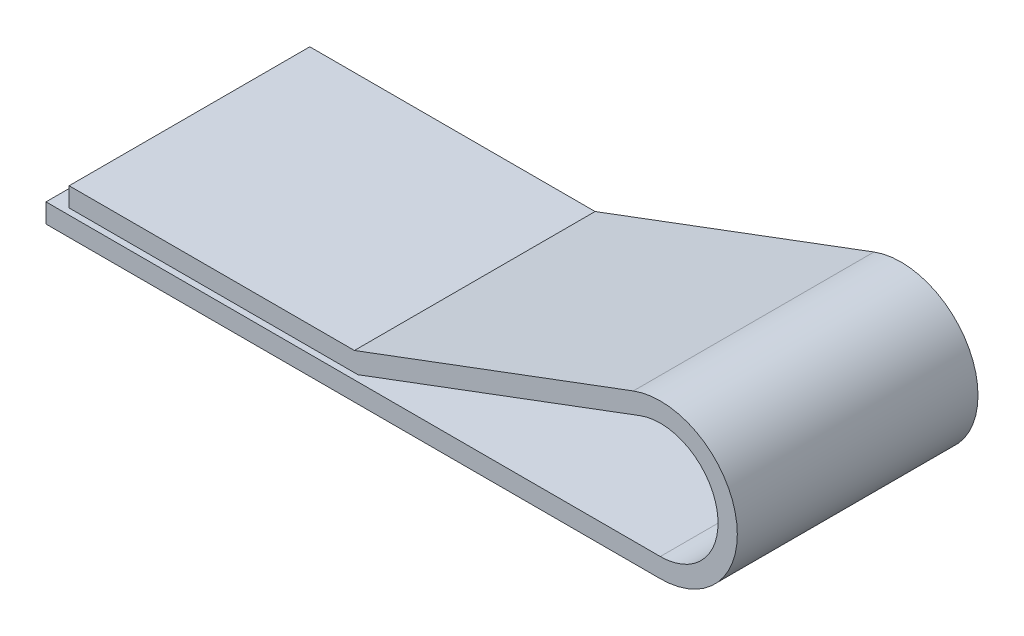
ISO-10303-21;
HEADER;
FILE_DESCRIPTION(('STEP AP214'),'2;1');
FILE_NAME('part.step','',(''),(''),'','','');
FILE_SCHEMA(('AUTOMOTIVE_DESIGN { 1 0 10303 214 1 1 1 1 }'));
ENDSEC;
DATA;
#1=APPLICATION_CONTEXT('core data for automotive mechanical design processes');
#2=APPLICATION_PROTOCOL_DEFINITION('international standard','automotive_design',2000,#1);
#3=PRODUCT_CONTEXT('',#1,'mechanical');
#4=PRODUCT('Part','Part','',(#3));
#5=PRODUCT_RELATED_PRODUCT_CATEGORY('part','',(#4));
#6=PRODUCT_DEFINITION_FORMATION('','',#4);
#7=PRODUCT_DEFINITION_CONTEXT('part definition',#1,'design');
#8=PRODUCT_DEFINITION('design','',#6,#7);
#9=PRODUCT_DEFINITION_SHAPE('','',#8);
#10=(LENGTH_UNIT() NAMED_UNIT(*) SI_UNIT(.MILLI.,.METRE.));
#11=(NAMED_UNIT(*) PLANE_ANGLE_UNIT() SI_UNIT($,.RADIAN.));
#12=(NAMED_UNIT(*) SI_UNIT($,.STERADIAN.) SOLID_ANGLE_UNIT());
#13=UNCERTAINTY_MEASURE_WITH_UNIT(LENGTH_MEASURE(1.E-05),#10,'distance_accuracy_value','');
#14=(GEOMETRIC_REPRESENTATION_CONTEXT(3) GLOBAL_UNCERTAINTY_ASSIGNED_CONTEXT((#13)) GLOBAL_UNIT_ASSIGNED_CONTEXT((#10,
#11,#12)) REPRESENTATION_CONTEXT('',''));
#15=CARTESIAN_POINT('',(0.,0.,0.));
#16=DIRECTION('',(0.,0.,1.));
#17=DIRECTION('',(1.,0.,0.));
#18=AXIS2_PLACEMENT_3D('',#15,#16,#17);
#19=CARTESIAN_POINT('',(-31.4091240449499,2.65,12.5));
#20=DIRECTION('',(0.,-1.,0.));
#21=DIRECTION('',(1.,0.,0.));
#22=AXIS2_PLACEMENT_3D('',#19,#20,#21);
#23=PLANE('',#22);
#24=DIRECTION('',(-1.,0.,0.));
#25=VECTOR('',#24,1.);
#26=CARTESIAN_POINT('',(-31.4091240449499,2.65,-12.5));
#27=LINE('',#26,#25);
#28=CARTESIAN_POINT('',(-31.7711621302751,2.65,-12.5));
#29=VERTEX_POINT('',#28);
#30=CARTESIAN_POINT('',(-61.4091240449499,2.64999999999997,-12.5));
#31=VERTEX_POINT('',#30);
#32=EDGE_CURVE('E157',#29,#31,#27,.T.);
#33=ORIENTED_EDGE('',*,*,#32,.T.);
#34=DIRECTION('',(0.,0.,-1.));
#35=VECTOR('',#34,1.);
#36=CARTESIAN_POINT('',(-61.4091240449499,2.64999999999997,12.5));
#37=LINE('',#36,#35);
#38=CARTESIAN_POINT('',(-61.4091240449499,2.64999999999997,12.5));
#39=VERTEX_POINT('',#38);
#40=EDGE_CURVE('E11',#39,#31,#37,.T.);
#41=ORIENTED_EDGE('',*,*,#40,.F.);
#42=DIRECTION('',(-1.,0.,0.));
#43=VECTOR('',#42,1.);
#44=CARTESIAN_POINT('',(-31.4091240449499,2.65,12.5));
#45=LINE('',#44,#43);
#46=CARTESIAN_POINT('',(-31.7711621302751,2.65,12.5));
#47=VERTEX_POINT('',#46);
#48=EDGE_CURVE('E108',#47,#39,#45,.T.);
#49=ORIENTED_EDGE('',*,*,#48,.F.);
#50=DIRECTION('',(0.,0.,-1.));
#51=VECTOR('',#50,1.);
#52=CARTESIAN_POINT('',(-31.7711621302751,2.65,12.5));
#53=LINE('',#52,#51);
#54=EDGE_CURVE('E153',#47,#29,#53,.T.);
#55=ORIENTED_EDGE('',*,*,#54,.T.);
#56=EDGE_LOOP('',(#33,#41,#49,#55));
#57=FACE_BOUND('',#56,.T.);
#58=ADVANCED_FACE('F45',(#57),#23,.F.);
#59=CARTESIAN_POINT('',(-61.4091240449499,0.649999999999969,12.5));
#60=DIRECTION('',(-1.,0.,0.));
#61=DIRECTION('',(0.,0.,1.));
#62=AXIS2_PLACEMENT_3D('',#59,#60,#61);
#63=PLANE('',#62);
#64=DIRECTION('',(0.,1.,0.));
#65=VECTOR('',#64,1.);
#66=CARTESIAN_POINT('',(-61.4091240449499,0.649999999999969,-12.5));
#67=LINE('',#66,#65);
#68=CARTESIAN_POINT('',(-61.4091240449499,0.649999999999969,-12.5));
#69=VERTEX_POINT('',#68);
#70=EDGE_CURVE('E161',#69,#31,#67,.T.);
#71=ORIENTED_EDGE('',*,*,#70,.F.);
#72=DIRECTION('',(0.,0.,-1.));
#73=VECTOR('',#72,1.);
#74=CARTESIAN_POINT('',(-61.4091240449499,0.649999999999969,12.5));
#75=LINE('',#74,#73);
#76=CARTESIAN_POINT('',(-61.4091240449499,0.649999999999969,12.5));
#77=VERTEX_POINT('',#76);
#78=EDGE_CURVE('E54',#77,#69,#75,.T.);
#79=ORIENTED_EDGE('',*,*,#78,.F.);
#80=DIRECTION('',(0.,1.,0.));
#81=VECTOR('',#80,1.);
#82=CARTESIAN_POINT('',(-61.4091240449499,0.649999999999969,12.5));
#83=LINE('',#82,#81);
#84=EDGE_CURVE('E231',#77,#39,#83,.T.);
#85=ORIENTED_EDGE('',*,*,#84,.T.);
#86=ORIENTED_EDGE('',*,*,#40,.T.);
#87=EDGE_LOOP('',(#71,#79,#85,#86));
#88=FACE_BOUND('',#87,.T.);
#89=ADVANCED_FACE('F218',(#88),#63,.T.);
#90=CARTESIAN_POINT('',(-31.4091240449499,0.650000000000001,12.5));
#91=DIRECTION('',(0.,-1.,0.));
#92=DIRECTION('',(1.,0.,0.));
#93=AXIS2_PLACEMENT_3D('',#90,#91,#92);
#94=PLANE('',#93);
#95=DIRECTION('',(-1.,0.,0.));
#96=VECTOR('',#95,1.);
#97=CARTESIAN_POINT('',(-31.4091240449499,0.650000000000001,-12.5));
#98=LINE('',#97,#96);
#99=CARTESIAN_POINT('',(-31.4091240449499,0.650000000000001,-12.5));
#100=VERTEX_POINT('',#99);
#101=EDGE_CURVE('E165',#100,#69,#98,.T.);
#102=ORIENTED_EDGE('',*,*,#101,.F.);
#103=DIRECTION('',(0.,0.,-1.));
#104=VECTOR('',#103,1.);
#105=CARTESIAN_POINT('',(-31.4091240449499,0.650000000000001,12.5));
#106=LINE('',#105,#104);
#107=CARTESIAN_POINT('',(-31.4091240449499,0.650000000000001,12.5));
#108=VERTEX_POINT('',#107);
#109=EDGE_CURVE('E206',#108,#100,#106,.T.);
#110=ORIENTED_EDGE('',*,*,#109,.F.);
#111=DIRECTION('',(-1.,0.,0.));
#112=VECTOR('',#111,1.);
#113=CARTESIAN_POINT('',(-31.4091240449499,0.650000000000001,12.5));
#114=LINE('',#113,#112);
#115=EDGE_CURVE('E215',#108,#77,#114,.T.);
#116=ORIENTED_EDGE('',*,*,#115,.T.);
#117=ORIENTED_EDGE('',*,*,#78,.T.);
#118=EDGE_LOOP('',(#102,#110,#116,#117));
#119=FACE_BOUND('',#118,.T.);
#120=ADVANCED_FACE('F213',(#119),#94,.T.);
#121=CARTESIAN_POINT('',(-2.10330755339884,11.6192612802588,12.5));
#122=DIRECTION('',(0.350551258899807,-0.936543546709794,0.));
#123=DIRECTION('',(0.936543546709794,0.350551258899807,0.));
#124=AXIS2_PLACEMENT_3D('',#121,#122,#123);
#125=PLANE('',#124);
#126=DIRECTION('',(-0.936543546709794,-0.350551258899807,0.));
#127=VECTOR('',#126,1.);
#128=CARTESIAN_POINT('',(-2.10330755339884,11.6192612802588,-12.5));
#129=LINE('',#128,#127);
#130=CARTESIAN_POINT('',(-2.10330755339884,11.6192612802588,-12.5));
#131=VERTEX_POINT('',#130);
#132=EDGE_CURVE('E169',#131,#100,#129,.T.);
#133=ORIENTED_EDGE('',*,*,#132,.F.);
#134=DIRECTION('',(0.,0.,-1.));
#135=VECTOR('',#134,1.);
#136=CARTESIAN_POINT('',(-2.10330755339884,11.6192612802588,12.5));
#137=LINE('',#136,#135);
#138=CARTESIAN_POINT('',(-2.10330755339884,11.6192612802588,12.5));
#139=VERTEX_POINT('',#138);
#140=EDGE_CURVE('E203',#139,#131,#137,.T.);
#141=ORIENTED_EDGE('',*,*,#140,.F.);
#142=DIRECTION('',(-0.936543546709794,-0.350551258899807,0.));
#143=VECTOR('',#142,1.);
#144=CARTESIAN_POINT('',(-2.10330755339884,11.6192612802588,12.5));
#145=LINE('',#144,#143);
#146=EDGE_CURVE('E228',#139,#108,#145,.T.);
#147=ORIENTED_EDGE('',*,*,#146,.T.);
#148=ORIENTED_EDGE('',*,*,#109,.T.);
#149=EDGE_LOOP('',(#133,#141,#147,#148));
#150=FACE_BOUND('',#149,.T.);
#151=ADVANCED_FACE('F225',(#150),#125,.T.);
#152=CARTESIAN_POINT('',(0.,6.00000000000001,12.5));
#153=DIRECTION('',(0.,0.,-1.));
#154=DIRECTION('',(-1.,0.,0.));
#155=AXIS2_PLACEMENT_3D('',#152,#153,#154);
#156=CYLINDRICAL_SURFACE('',#155,5.99999999999998);
#157=CARTESIAN_POINT('',(0.,6.00000000000001,-12.5));
#158=DIRECTION('',(0.,0.,1.));
#159=DIRECTION('',(1.,0.,0.));
#160=AXIS2_PLACEMENT_3D('',#157,#158,#159);
#161=CIRCLE('',#160,5.99999999999998);
#162=CARTESIAN_POINT('',(0.,0.,-12.5));
#163=VERTEX_POINT('',#162);
#164=EDGE_CURVE('E173',#163,#131,#161,.T.);
#165=ORIENTED_EDGE('',*,*,#164,.F.);
#166=DIRECTION('',(0.,0.,-1.));
#167=VECTOR('',#166,1.);
#168=CARTESIAN_POINT('',(0.,0.,12.5));
#169=LINE('',#168,#167);
#170=CARTESIAN_POINT('',(0.,0.,12.5));
#171=VERTEX_POINT('',#170);
#172=EDGE_CURVE('E200',#171,#163,#169,.T.);
#173=ORIENTED_EDGE('',*,*,#172,.F.);
#174=CARTESIAN_POINT('',(0.,6.00000000000001,12.5));
#175=DIRECTION('',(0.,0.,1.));
#176=DIRECTION('',(1.,0.,0.));
#177=AXIS2_PLACEMENT_3D('',#174,#175,#176);
#178=CIRCLE('',#177,5.99999999999998);
#179=EDGE_CURVE('E236',#171,#139,#178,.T.);
#180=ORIENTED_EDGE('',*,*,#179,.T.);
#181=ORIENTED_EDGE('',*,*,#140,.T.);
#182=EDGE_LOOP('',(#165,#173,#180,#181));
#183=FACE_BOUND('',#182,.T.);
#184=ADVANCED_FACE('F273',(#183),#156,.F.);
#185=CARTESIAN_POINT('',(-63.8095549665831,0.,12.5));
#186=DIRECTION('',(0.,1.,0.));
#187=DIRECTION('',(-1.,0.,0.));
#188=AXIS2_PLACEMENT_3D('',#185,#186,#187);
#189=PLANE('',#188);
#190=DIRECTION('',(1.,0.,0.));
#191=VECTOR('',#190,1.);
#192=CARTESIAN_POINT('',(-63.8095549665831,0.,-12.5));
#193=LINE('',#192,#191);
#194=CARTESIAN_POINT('',(-63.8095549665831,0.,-12.5));
#195=VERTEX_POINT('',#194);
#196=EDGE_CURVE('E177',#195,#163,#193,.T.);
#197=ORIENTED_EDGE('',*,*,#196,.F.);
#198=DIRECTION('',(0.,0.,-1.));
#199=VECTOR('',#198,1.);
#200=CARTESIAN_POINT('',(-63.8095549665831,0.,12.5));
#201=LINE('',#200,#199);
#202=CARTESIAN_POINT('',(-63.8095549665831,0.,12.5));
#203=VERTEX_POINT('',#202);
#204=EDGE_CURVE('E197',#203,#195,#201,.T.);
#205=ORIENTED_EDGE('',*,*,#204,.F.);
#206=DIRECTION('',(1.,0.,0.));
#207=VECTOR('',#206,1.);
#208=CARTESIAN_POINT('',(-63.8095549665831,0.,12.5));
#209=LINE('',#208,#207);
#210=EDGE_CURVE('E243',#203,#171,#209,.T.);
#211=ORIENTED_EDGE('',*,*,#210,.T.);
#212=ORIENTED_EDGE('',*,*,#172,.T.);
#213=EDGE_LOOP('',(#197,#205,#211,#212));
#214=FACE_BOUND('',#213,.T.);
#215=ADVANCED_FACE('F276',(#214),#189,.T.);
#216=CARTESIAN_POINT('',(-63.8095549665831,-2.,12.5));
#217=DIRECTION('',(-1.,0.,0.));
#218=DIRECTION('',(0.,0.,1.));
#219=AXIS2_PLACEMENT_3D('',#216,#217,#218);
#220=PLANE('',#219);
#221=DIRECTION('',(0.,1.,0.));
#222=VECTOR('',#221,1.);
#223=CARTESIAN_POINT('',(-63.8095549665831,-2.,-12.5));
#224=LINE('',#223,#222);
#225=CARTESIAN_POINT('',(-63.8095549665831,-2.,-12.5));
#226=VERTEX_POINT('',#225);
#227=EDGE_CURVE('E181',#226,#195,#224,.T.);
#228=ORIENTED_EDGE('',*,*,#227,.F.);
#229=DIRECTION('',(0.,0.,-1.));
#230=VECTOR('',#229,1.);
#231=CARTESIAN_POINT('',(-63.8095549665831,-2.,12.5));
#232=LINE('',#231,#230);
#233=CARTESIAN_POINT('',(-63.8095549665831,-2.,12.5));
#234=VERTEX_POINT('',#233);
#235=EDGE_CURVE('E146',#234,#226,#232,.T.);
#236=ORIENTED_EDGE('',*,*,#235,.F.);
#237=DIRECTION('',(0.,1.,0.));
#238=VECTOR('',#237,1.);
#239=CARTESIAN_POINT('',(-63.8095549665831,-2.,12.5));
#240=LINE('',#239,#238);
#241=EDGE_CURVE('E137',#234,#203,#240,.T.);
#242=ORIENTED_EDGE('',*,*,#241,.T.);
#243=ORIENTED_EDGE('',*,*,#204,.T.);
#244=EDGE_LOOP('',(#228,#236,#242,#243));
#245=FACE_BOUND('',#244,.T.);
#246=ADVANCED_FACE('F249',(#245),#220,.T.);
#247=CARTESIAN_POINT('',(-63.8095549665831,-2.,12.5));
#248=DIRECTION('',(0.,1.,0.));
#249=DIRECTION('',(-1.,0.,0.));
#250=AXIS2_PLACEMENT_3D('',#247,#248,#249);
#251=PLANE('',#250);
#252=DIRECTION('',(1.,0.,0.));
#253=VECTOR('',#252,1.);
#254=CARTESIAN_POINT('',(-63.8095549665831,-2.,-12.5));
#255=LINE('',#254,#253);
#256=CARTESIAN_POINT('',(0.,-1.99999999999997,-12.5));
#257=VERTEX_POINT('',#256);
#258=EDGE_CURVE('E144',#226,#257,#255,.T.);
#259=ORIENTED_EDGE('',*,*,#258,.T.);
#260=DIRECTION('',(0.,0.,-1.));
#261=VECTOR('',#260,1.);
#262=CARTESIAN_POINT('',(0.,-1.99999999999997,12.5));
#263=LINE('',#262,#261);
#264=CARTESIAN_POINT('',(0.,-1.99999999999997,12.5));
#265=VERTEX_POINT('',#264);
#266=EDGE_CURVE('E141',#265,#257,#263,.T.);
#267=ORIENTED_EDGE('',*,*,#266,.F.);
#268=DIRECTION('',(1.,0.,0.));
#269=VECTOR('',#268,1.);
#270=CARTESIAN_POINT('',(-63.8095549665831,-2.,12.5));
#271=LINE('',#270,#269);
#272=EDGE_CURVE('E130',#234,#265,#271,.T.);
#273=ORIENTED_EDGE('',*,*,#272,.F.);
#274=ORIENTED_EDGE('',*,*,#235,.T.);
#275=EDGE_LOOP('',(#259,#267,#273,#274));
#276=FACE_BOUND('',#275,.T.);
#277=ADVANCED_FACE('F142',(#276),#251,.F.);
#278=CARTESIAN_POINT('',(0.,6.00000000000001,12.5));
#279=DIRECTION('',(0.,0.,-1.));
#280=DIRECTION('',(-1.,0.,0.));
#281=AXIS2_PLACEMENT_3D('',#278,#279,#280);
#282=CYLINDRICAL_SURFACE('',#281,7.99999999999998);
#283=CARTESIAN_POINT('',(0.,6.00000000000001,-12.5));
#284=DIRECTION('',(0.,0.,1.));
#285=DIRECTION('',(1.,0.,0.));
#286=AXIS2_PLACEMENT_3D('',#283,#284,#285);
#287=CIRCLE('',#286,7.99999999999998);
#288=CARTESIAN_POINT('',(-2.80441007119845,13.4923483736784,-12.5));
#289=VERTEX_POINT('',#288);
#290=EDGE_CURVE('E96',#257,#289,#287,.T.);
#291=ORIENTED_EDGE('',*,*,#290,.T.);
#292=DIRECTION('',(0.,0.,-1.));
#293=VECTOR('',#292,1.);
#294=CARTESIAN_POINT('',(-2.80441007119845,13.4923483736784,12.5));
#295=LINE('',#294,#293);
#296=CARTESIAN_POINT('',(-2.80441007119845,13.4923483736784,12.5));
#297=VERTEX_POINT('',#296);
#298=EDGE_CURVE('E147',#297,#289,#295,.T.);
#299=ORIENTED_EDGE('',*,*,#298,.F.);
#300=CARTESIAN_POINT('',(0.,6.00000000000001,12.5));
#301=DIRECTION('',(0.,0.,1.));
#302=DIRECTION('',(1.,0.,0.));
#303=AXIS2_PLACEMENT_3D('',#300,#301,#302);
#304=CIRCLE('',#303,7.99999999999998);
#305=EDGE_CURVE('E134',#265,#297,#304,.T.);
#306=ORIENTED_EDGE('',*,*,#305,.F.);
#307=ORIENTED_EDGE('',*,*,#266,.T.);
#308=EDGE_LOOP('',(#291,#299,#306,#307));
#309=FACE_BOUND('',#308,.T.);
#310=ADVANCED_FACE('F149',(#309),#282,.T.);
#311=CARTESIAN_POINT('',(-2.80441007119845,13.4923483736784,12.5));
#312=DIRECTION('',(0.350551258899807,-0.936543546709794,0.));
#313=DIRECTION('',(0.936543546709794,0.350551258899807,0.));
#314=AXIS2_PLACEMENT_3D('',#311,#312,#313);
#315=PLANE('',#314);
#316=DIRECTION('',(-0.936543546709794,-0.350551258899807,0.));
#317=VECTOR('',#316,1.);
#318=CARTESIAN_POINT('',(-2.80441007119845,13.4923483736784,-12.5));
#319=LINE('',#318,#317);
#320=EDGE_CURVE('E102',#289,#29,#319,.T.);
#321=ORIENTED_EDGE('',*,*,#320,.T.);
#322=ORIENTED_EDGE('',*,*,#54,.F.);
#323=DIRECTION('',(-0.936543546709794,-0.350551258899807,0.));
#324=VECTOR('',#323,1.);
#325=CARTESIAN_POINT('',(-2.80441007119845,13.4923483736784,12.5));
#326=LINE('',#325,#324);
#327=EDGE_CURVE('E62',#297,#47,#326,.T.);
#328=ORIENTED_EDGE('',*,*,#327,.F.);
#329=ORIENTED_EDGE('',*,*,#298,.T.);
#330=EDGE_LOOP('',(#321,#322,#328,#329));
#331=FACE_BOUND('',#330,.T.);
#332=ADVANCED_FACE('F252',(#331),#315,.F.);
#333=CARTESIAN_POINT('',(0.,6.00000000000001,12.5));
#334=DIRECTION('',(0.,0.,1.));
#335=DIRECTION('',(1.,0.,0.));
#336=AXIS2_PLACEMENT_3D('',#333,#334,#335);
#337=PLANE('',#336);
#338=ORIENTED_EDGE('',*,*,#48,.T.);
#339=ORIENTED_EDGE('',*,*,#84,.F.);
#340=ORIENTED_EDGE('',*,*,#115,.F.);
#341=ORIENTED_EDGE('',*,*,#146,.F.);
#342=ORIENTED_EDGE('',*,*,#179,.F.);
#343=ORIENTED_EDGE('',*,*,#210,.F.);
#344=ORIENTED_EDGE('',*,*,#241,.F.);
#345=ORIENTED_EDGE('',*,*,#272,.T.);
#346=ORIENTED_EDGE('',*,*,#305,.T.);
#347=ORIENTED_EDGE('',*,*,#327,.T.);
#348=EDGE_LOOP('',(#338,#339,#340,#341,#342,#343,#344,#345,#346,#347));
#349=FACE_BOUND('',#348,.T.);
#350=ADVANCED_FACE('F132',(#349),#337,.T.);
#351=CARTESIAN_POINT('',(0.,6.00000000000001,-12.5));
#352=DIRECTION('',(0.,0.,1.));
#353=DIRECTION('',(1.,0.,0.));
#354=AXIS2_PLACEMENT_3D('',#351,#352,#353);
#355=PLANE('',#354);
#356=ORIENTED_EDGE('',*,*,#32,.F.);
#357=ORIENTED_EDGE('',*,*,#320,.F.);
#358=ORIENTED_EDGE('',*,*,#290,.F.);
#359=ORIENTED_EDGE('',*,*,#258,.F.);
#360=ORIENTED_EDGE('',*,*,#227,.T.);
#361=ORIENTED_EDGE('',*,*,#196,.T.);
#362=ORIENTED_EDGE('',*,*,#164,.T.);
#363=ORIENTED_EDGE('',*,*,#132,.T.);
#364=ORIENTED_EDGE('',*,*,#101,.T.);
#365=ORIENTED_EDGE('',*,*,#70,.T.);
#366=EDGE_LOOP('',(#356,#357,#358,#359,#360,#361,#362,#363,#364,#365));
#367=FACE_BOUND('',#366,.T.);
#368=ADVANCED_FACE('F221',(#367),#355,.F.);
#369=CLOSED_SHELL('',(#58,#89,#120,#151,#184,#215,#246,#277,#310,#332,#350,#368));
#370=MANIFOLD_SOLID_BREP('B2',#369);
#371=ADVANCED_BREP_SHAPE_REPRESENTATION('',(#18,#370),#14);
#372=SHAPE_DEFINITION_REPRESENTATION(#9,#371);
ENDSEC;
END-ISO-10303-21;
